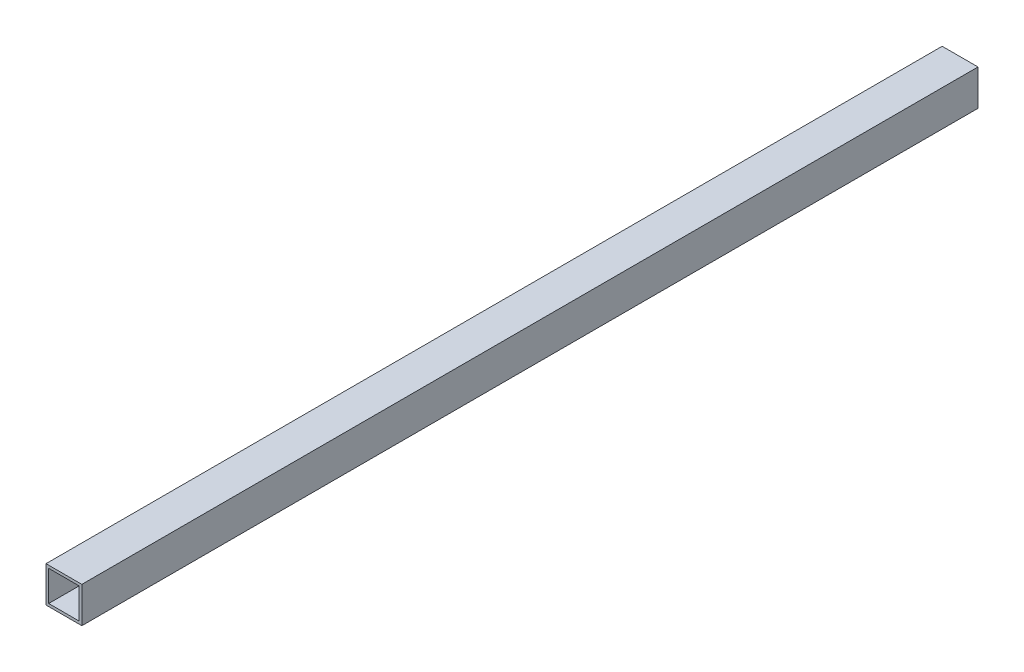
ISO-10303-21;
HEADER;
FILE_DESCRIPTION(('STEP AP214'),'2;1');
FILE_NAME('part.step','',(''),(''),'','','');
FILE_SCHEMA(('AUTOMOTIVE_DESIGN { 1 0 10303 214 1 1 1 1 }'));
ENDSEC;
DATA;
#1=APPLICATION_CONTEXT('core data for automotive mechanical design processes');
#2=APPLICATION_PROTOCOL_DEFINITION('international standard','automotive_design',2000,#1);
#3=PRODUCT_CONTEXT('',#1,'mechanical');
#4=PRODUCT('Part','Part','',(#3));
#5=PRODUCT_RELATED_PRODUCT_CATEGORY('part','',(#4));
#6=PRODUCT_DEFINITION_FORMATION('','',#4);
#7=PRODUCT_DEFINITION_CONTEXT('part definition',#1,'design');
#8=PRODUCT_DEFINITION('design','',#6,#7);
#9=PRODUCT_DEFINITION_SHAPE('','',#8);
#10=(LENGTH_UNIT() NAMED_UNIT(*) SI_UNIT(.MILLI.,.METRE.));
#11=(NAMED_UNIT(*) PLANE_ANGLE_UNIT() SI_UNIT($,.RADIAN.));
#12=(NAMED_UNIT(*) SI_UNIT($,.STERADIAN.) SOLID_ANGLE_UNIT());
#13=UNCERTAINTY_MEASURE_WITH_UNIT(LENGTH_MEASURE(1.E-05),#10,'distance_accuracy_value','');
#14=(GEOMETRIC_REPRESENTATION_CONTEXT(3) GLOBAL_UNCERTAINTY_ASSIGNED_CONTEXT((#13)) GLOBAL_UNIT_ASSIGNED_CONTEXT((#10,
#11,#12)) REPRESENTATION_CONTEXT('',''));
#15=CARTESIAN_POINT('',(0.,0.,0.));
#16=DIRECTION('',(0.,0.,1.));
#17=DIRECTION('',(1.,0.,0.));
#18=AXIS2_PLACEMENT_3D('',#15,#16,#17);
#19=CARTESIAN_POINT('',(20.,20.,1000.));
#20=DIRECTION('',(-1.,0.,0.));
#21=DIRECTION('',(0.,-1.,0.));
#22=AXIS2_PLACEMENT_3D('',#19,#20,#21);
#23=PLANE('',#22);
#24=DIRECTION('',(0.,1.,0.));
#25=VECTOR('',#24,1.);
#26=CARTESIAN_POINT('',(20.,20.,0.));
#27=LINE('',#26,#25);
#28=CARTESIAN_POINT('',(20.,-20.,0.));
#29=VERTEX_POINT('',#28);
#30=CARTESIAN_POINT('',(20.,20.,0.));
#31=VERTEX_POINT('',#30);
#32=EDGE_CURVE('E147',#29,#31,#27,.T.);
#33=ORIENTED_EDGE('',*,*,#32,.T.);
#34=DIRECTION('',(0.,0.,-1.));
#35=VECTOR('',#34,1.);
#36=CARTESIAN_POINT('',(20.,20.,1000.));
#37=LINE('',#36,#35);
#38=CARTESIAN_POINT('',(20.,20.,1000.));
#39=VERTEX_POINT('',#38);
#40=EDGE_CURVE('E11',#39,#31,#37,.T.);
#41=ORIENTED_EDGE('',*,*,#40,.F.);
#42=DIRECTION('',(0.,1.,0.));
#43=VECTOR('',#42,1.);
#44=CARTESIAN_POINT('',(20.,20.,1000.));
#45=LINE('',#44,#43);
#46=CARTESIAN_POINT('',(20.,-20.,1000.));
#47=VERTEX_POINT('',#46);
#48=EDGE_CURVE('E153',#47,#39,#45,.T.);
#49=ORIENTED_EDGE('',*,*,#48,.F.);
#50=DIRECTION('',(0.,0.,-1.));
#51=VECTOR('',#50,1.);
#52=CARTESIAN_POINT('',(20.,-20.,1000.));
#53=LINE('',#52,#51);
#54=EDGE_CURVE('E167',#47,#29,#53,.T.);
#55=ORIENTED_EDGE('',*,*,#54,.T.);
#56=EDGE_LOOP('',(#33,#41,#49,#55));
#57=FACE_BOUND('',#56,.T.);
#58=ADVANCED_FACE('F39',(#57),#23,.F.);
#59=CARTESIAN_POINT('',(-20.,20.,1000.));
#60=DIRECTION('',(0.,-1.,0.));
#61=DIRECTION('',(0.,0.,-1.));
#62=AXIS2_PLACEMENT_3D('',#59,#60,#61);
#63=PLANE('',#62);
#64=DIRECTION('',(-1.,0.,0.));
#65=VECTOR('',#64,1.);
#66=CARTESIAN_POINT('',(-20.,20.,0.));
#67=LINE('',#66,#65);
#68=CARTESIAN_POINT('',(-20.,20.,0.));
#69=VERTEX_POINT('',#68);
#70=EDGE_CURVE('E171',#31,#69,#67,.T.);
#71=ORIENTED_EDGE('',*,*,#70,.T.);
#72=DIRECTION('',(0.,0.,-1.));
#73=VECTOR('',#72,1.);
#74=CARTESIAN_POINT('',(-20.,20.,1000.));
#75=LINE('',#74,#73);
#76=CARTESIAN_POINT('',(-20.,20.,1000.));
#77=VERTEX_POINT('',#76);
#78=EDGE_CURVE('E47',#77,#69,#75,.T.);
#79=ORIENTED_EDGE('',*,*,#78,.F.);
#80=DIRECTION('',(-1.,0.,0.));
#81=VECTOR('',#80,1.);
#82=CARTESIAN_POINT('',(-20.,20.,1000.));
#83=LINE('',#82,#81);
#84=EDGE_CURVE('E157',#39,#77,#83,.T.);
#85=ORIENTED_EDGE('',*,*,#84,.F.);
#86=ORIENTED_EDGE('',*,*,#40,.T.);
#87=EDGE_LOOP('',(#71,#79,#85,#86));
#88=FACE_BOUND('',#87,.T.);
#89=ADVANCED_FACE('F205',(#88),#63,.F.);
#90=CARTESIAN_POINT('',(-20.,20.,1000.));
#91=DIRECTION('',(1.,0.,0.));
#92=DIRECTION('',(0.,0.,-1.));
#93=AXIS2_PLACEMENT_3D('',#90,#91,#92);
#94=PLANE('',#93);
#95=DIRECTION('',(0.,-1.,0.));
#96=VECTOR('',#95,1.);
#97=CARTESIAN_POINT('',(-20.,20.,0.));
#98=LINE('',#97,#96);
#99=CARTESIAN_POINT('',(-20.,-20.,0.));
#100=VERTEX_POINT('',#99);
#101=EDGE_CURVE('E174',#69,#100,#98,.T.);
#102=ORIENTED_EDGE('',*,*,#101,.T.);
#103=DIRECTION('',(0.,0.,-1.));
#104=VECTOR('',#103,1.);
#105=CARTESIAN_POINT('',(-20.,-20.,1000.));
#106=LINE('',#105,#104);
#107=CARTESIAN_POINT('',(-20.,-20.,1000.));
#108=VERTEX_POINT('',#107);
#109=EDGE_CURVE('E182',#108,#100,#106,.T.);
#110=ORIENTED_EDGE('',*,*,#109,.F.);
#111=DIRECTION('',(0.,-1.,0.));
#112=VECTOR('',#111,1.);
#113=CARTESIAN_POINT('',(-20.,20.,1000.));
#114=LINE('',#113,#112);
#115=EDGE_CURVE('E161',#77,#108,#114,.T.);
#116=ORIENTED_EDGE('',*,*,#115,.F.);
#117=ORIENTED_EDGE('',*,*,#78,.T.);
#118=EDGE_LOOP('',(#102,#110,#116,#117));
#119=FACE_BOUND('',#118,.T.);
#120=ADVANCED_FACE('F191',(#119),#94,.F.);
#121=CARTESIAN_POINT('',(-20.,-20.,1000.));
#122=DIRECTION('',(0.,1.,0.));
#123=DIRECTION('',(0.,0.,1.));
#124=AXIS2_PLACEMENT_3D('',#121,#122,#123);
#125=PLANE('',#124);
#126=DIRECTION('',(1.,0.,0.));
#127=VECTOR('',#126,1.);
#128=CARTESIAN_POINT('',(-20.,-20.,0.));
#129=LINE('',#128,#127);
#130=EDGE_CURVE('E158',#100,#29,#129,.T.);
#131=ORIENTED_EDGE('',*,*,#130,.T.);
#132=ORIENTED_EDGE('',*,*,#54,.F.);
#133=DIRECTION('',(1.,0.,0.));
#134=VECTOR('',#133,1.);
#135=CARTESIAN_POINT('',(-20.,-20.,1000.));
#136=LINE('',#135,#134);
#137=EDGE_CURVE('E164',#108,#47,#136,.T.);
#138=ORIENTED_EDGE('',*,*,#137,.F.);
#139=ORIENTED_EDGE('',*,*,#109,.T.);
#140=EDGE_LOOP('',(#131,#132,#138,#139));
#141=FACE_BOUND('',#140,.T.);
#142=ADVANCED_FACE('F200',(#141),#125,.F.);
#143=CARTESIAN_POINT('',(0.,0.,1000.));
#144=DIRECTION('',(0.,0.,1.));
#145=DIRECTION('',(1.,0.,0.));
#146=AXIS2_PLACEMENT_3D('',#143,#144,#145);
#147=PLANE('',#146);
#148=DIRECTION('',(0.,1.,0.));
#149=VECTOR('',#148,1.);
#150=CARTESIAN_POINT('',(-17.,17.,1000.));
#151=LINE('',#150,#149);
#152=CARTESIAN_POINT('',(-17.,-17.,1000.));
#153=VERTEX_POINT('',#152);
#154=CARTESIAN_POINT('',(-17.,17.,1000.));
#155=VERTEX_POINT('',#154);
#156=EDGE_CURVE('E106',#153,#155,#151,.T.);
#157=ORIENTED_EDGE('',*,*,#156,.T.);
#158=DIRECTION('',(1.,0.,0.));
#159=VECTOR('',#158,1.);
#160=CARTESIAN_POINT('',(17.,17.,1000.));
#161=LINE('',#160,#159);
#162=CARTESIAN_POINT('',(17.,17.,1000.));
#163=VERTEX_POINT('',#162);
#164=EDGE_CURVE('E116',#155,#163,#161,.T.);
#165=ORIENTED_EDGE('',*,*,#164,.T.);
#166=DIRECTION('',(0.,-1.,0.));
#167=VECTOR('',#166,1.);
#168=CARTESIAN_POINT('',(17.,17.,1000.));
#169=LINE('',#168,#167);
#170=CARTESIAN_POINT('',(17.,-17.,1000.));
#171=VERTEX_POINT('',#170);
#172=EDGE_CURVE('E54',#163,#171,#169,.T.);
#173=ORIENTED_EDGE('',*,*,#172,.T.);
#174=DIRECTION('',(-1.,0.,0.));
#175=VECTOR('',#174,1.);
#176=CARTESIAN_POINT('',(17.,-17.,1000.));
#177=LINE('',#176,#175);
#178=EDGE_CURVE('E113',#171,#153,#177,.T.);
#179=ORIENTED_EDGE('',*,*,#178,.T.);
#180=EDGE_LOOP('',(#157,#165,#173,#179));
#181=FACE_BOUND('',#180,.T.);
#182=ORIENTED_EDGE('',*,*,#48,.T.);
#183=ORIENTED_EDGE('',*,*,#84,.T.);
#184=ORIENTED_EDGE('',*,*,#115,.T.);
#185=ORIENTED_EDGE('',*,*,#137,.T.);
#186=EDGE_LOOP('',(#182,#183,#184,#185));
#187=FACE_BOUND('',#186,.T.);
#188=ADVANCED_FACE('F121',(#181,#187),#147,.T.);
#189=CARTESIAN_POINT('',(0.,0.,0.));
#190=DIRECTION('',(0.,0.,1.));
#191=DIRECTION('',(1.,0.,0.));
#192=AXIS2_PLACEMENT_3D('',#189,#190,#191);
#193=PLANE('',#192);
#194=DIRECTION('',(1.,0.,0.));
#195=VECTOR('',#194,1.);
#196=CARTESIAN_POINT('',(17.,17.,0.));
#197=LINE('',#196,#195);
#198=CARTESIAN_POINT('',(-17.,17.,0.));
#199=VERTEX_POINT('',#198);
#200=CARTESIAN_POINT('',(17.,17.,0.));
#201=VERTEX_POINT('',#200);
#202=EDGE_CURVE('E138',#199,#201,#197,.T.);
#203=ORIENTED_EDGE('',*,*,#202,.F.);
#204=DIRECTION('',(0.,1.,0.));
#205=VECTOR('',#204,1.);
#206=CARTESIAN_POINT('',(-17.,17.,0.));
#207=LINE('',#206,#205);
#208=CARTESIAN_POINT('',(-17.,-17.,0.));
#209=VERTEX_POINT('',#208);
#210=EDGE_CURVE('E62',#209,#199,#207,.T.);
#211=ORIENTED_EDGE('',*,*,#210,.F.);
#212=DIRECTION('',(-1.,0.,0.));
#213=VECTOR('',#212,1.);
#214=CARTESIAN_POINT('',(17.,-17.,0.));
#215=LINE('',#214,#213);
#216=CARTESIAN_POINT('',(17.,-17.,0.));
#217=VERTEX_POINT('',#216);
#218=EDGE_CURVE('E125',#217,#209,#215,.T.);
#219=ORIENTED_EDGE('',*,*,#218,.F.);
#220=DIRECTION('',(0.,-1.,0.));
#221=VECTOR('',#220,1.);
#222=CARTESIAN_POINT('',(17.,17.,0.));
#223=LINE('',#222,#221);
#224=EDGE_CURVE('E129',#201,#217,#223,.T.);
#225=ORIENTED_EDGE('',*,*,#224,.F.);
#226=EDGE_LOOP('',(#203,#211,#219,#225));
#227=FACE_BOUND('',#226,.T.);
#228=ORIENTED_EDGE('',*,*,#32,.F.);
#229=ORIENTED_EDGE('',*,*,#130,.F.);
#230=ORIENTED_EDGE('',*,*,#101,.F.);
#231=ORIENTED_EDGE('',*,*,#70,.F.);
#232=EDGE_LOOP('',(#228,#229,#230,#231));
#233=FACE_BOUND('',#232,.T.);
#234=ADVANCED_FACE('F197',(#227,#233),#193,.F.);
#235=CARTESIAN_POINT('',(-17.,17.,1000.));
#236=DIRECTION('',(-1.,0.,0.));
#237=DIRECTION('',(0.,-1.,0.));
#238=AXIS2_PLACEMENT_3D('',#235,#236,#237);
#239=PLANE('',#238);
#240=ORIENTED_EDGE('',*,*,#210,.T.);
#241=DIRECTION('',(0.,0.,-1.));
#242=VECTOR('',#241,1.);
#243=CARTESIAN_POINT('',(-17.,17.,1000.));
#244=LINE('',#243,#242);
#245=EDGE_CURVE('E102',#155,#199,#244,.T.);
#246=ORIENTED_EDGE('',*,*,#245,.F.);
#247=ORIENTED_EDGE('',*,*,#156,.F.);
#248=DIRECTION('',(0.,0.,-1.));
#249=VECTOR('',#248,1.);
#250=CARTESIAN_POINT('',(-17.,-17.,1000.));
#251=LINE('',#250,#249);
#252=EDGE_CURVE('E144',#153,#209,#251,.T.);
#253=ORIENTED_EDGE('',*,*,#252,.T.);
#254=EDGE_LOOP('',(#240,#246,#247,#253));
#255=FACE_BOUND('',#254,.T.);
#256=ADVANCED_FACE('F104',(#255),#239,.F.);
#257=CARTESIAN_POINT('',(17.,-17.,1000.));
#258=DIRECTION('',(0.,-1.,0.));
#259=DIRECTION('',(0.,0.,-1.));
#260=AXIS2_PLACEMENT_3D('',#257,#258,#259);
#261=PLANE('',#260);
#262=ORIENTED_EDGE('',*,*,#218,.T.);
#263=ORIENTED_EDGE('',*,*,#252,.F.);
#264=ORIENTED_EDGE('',*,*,#178,.F.);
#265=DIRECTION('',(0.,0.,-1.));
#266=VECTOR('',#265,1.);
#267=CARTESIAN_POINT('',(17.,-17.,1000.));
#268=LINE('',#267,#266);
#269=EDGE_CURVE('E148',#171,#217,#268,.T.);
#270=ORIENTED_EDGE('',*,*,#269,.T.);
#271=EDGE_LOOP('',(#262,#263,#264,#270));
#272=FACE_BOUND('',#271,.T.);
#273=ADVANCED_FACE('F222',(#272),#261,.F.);
#274=CARTESIAN_POINT('',(17.,17.,1000.));
#275=DIRECTION('',(1.,0.,0.));
#276=DIRECTION('',(0.,1.,0.));
#277=AXIS2_PLACEMENT_3D('',#274,#275,#276);
#278=PLANE('',#277);
#279=ORIENTED_EDGE('',*,*,#224,.T.);
#280=ORIENTED_EDGE('',*,*,#269,.F.);
#281=ORIENTED_EDGE('',*,*,#172,.F.);
#282=DIRECTION('',(0.,0.,-1.));
#283=VECTOR('',#282,1.);
#284=CARTESIAN_POINT('',(17.,17.,1000.));
#285=LINE('',#284,#283);
#286=EDGE_CURVE('E112',#163,#201,#285,.T.);
#287=ORIENTED_EDGE('',*,*,#286,.T.);
#288=EDGE_LOOP('',(#279,#280,#281,#287));
#289=FACE_BOUND('',#288,.T.);
#290=ADVANCED_FACE('F225',(#289),#278,.F.);
#291=CARTESIAN_POINT('',(17.,17.,1000.));
#292=DIRECTION('',(0.,1.,0.));
#293=DIRECTION('',(0.,0.,1.));
#294=AXIS2_PLACEMENT_3D('',#291,#292,#293);
#295=PLANE('',#294);
#296=ORIENTED_EDGE('',*,*,#202,.T.);
#297=ORIENTED_EDGE('',*,*,#286,.F.);
#298=ORIENTED_EDGE('',*,*,#164,.F.);
#299=ORIENTED_EDGE('',*,*,#245,.T.);
#300=EDGE_LOOP('',(#296,#297,#298,#299));
#301=FACE_BOUND('',#300,.T.);
#302=ADVANCED_FACE('F117',(#301),#295,.F.);
#303=CLOSED_SHELL('',(#58,#89,#120,#142,#188,#234,#256,#273,#290,#302));
#304=MANIFOLD_SOLID_BREP('B2',#303);
#305=ADVANCED_BREP_SHAPE_REPRESENTATION('',(#18,#304),#14);
#306=SHAPE_DEFINITION_REPRESENTATION(#9,#305);
ENDSEC;
END-ISO-10303-21;
